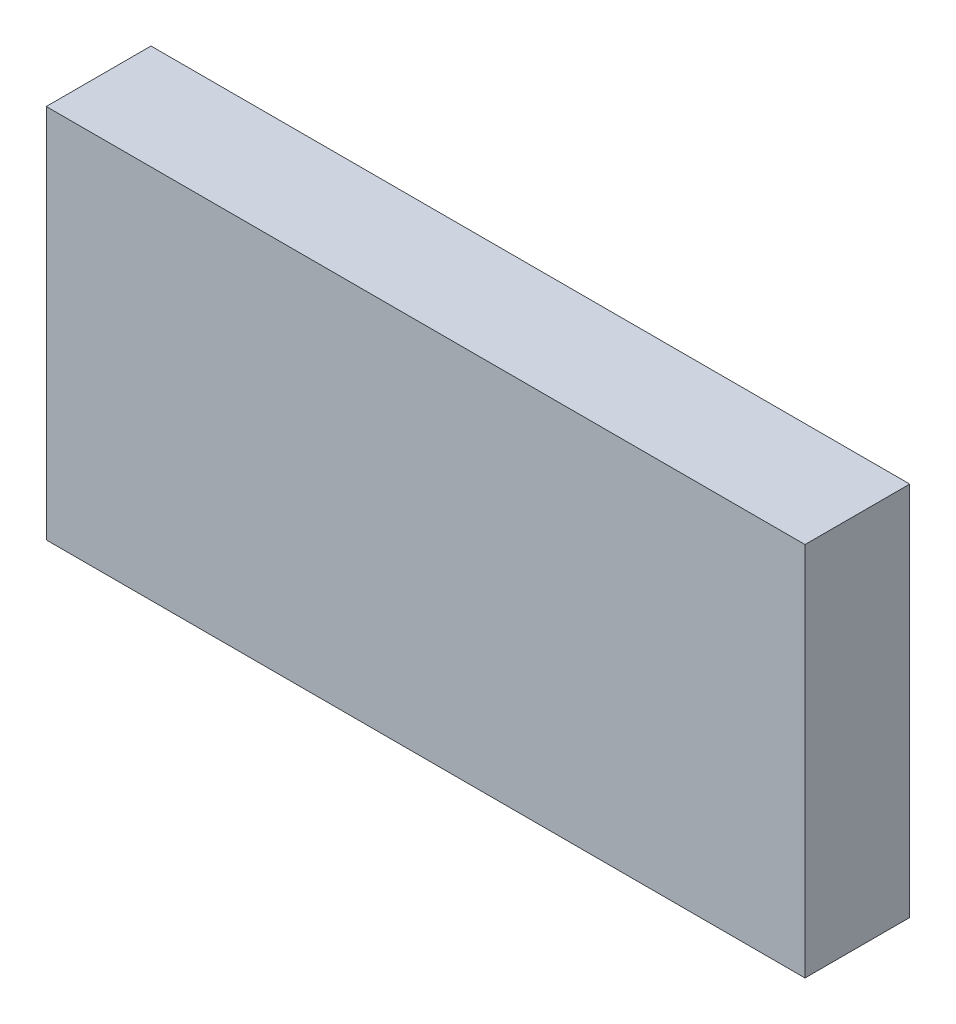
ISO-10303-21;
HEADER;
FILE_DESCRIPTION(('STEP AP214'),'2;1');
FILE_NAME('part.step','',(''),(''),'','','');
FILE_SCHEMA(('AUTOMOTIVE_DESIGN { 1 0 10303 214 1 1 1 1 }'));
ENDSEC;
DATA;
#1=APPLICATION_CONTEXT('core data for automotive mechanical design processes');
#2=APPLICATION_PROTOCOL_DEFINITION('international standard','automotive_design',2000,#1);
#3=PRODUCT_CONTEXT('',#1,'mechanical');
#4=PRODUCT('Part','Part','',(#3));
#5=PRODUCT_RELATED_PRODUCT_CATEGORY('part','',(#4));
#6=PRODUCT_DEFINITION_FORMATION('','',#4);
#7=PRODUCT_DEFINITION_CONTEXT('part definition',#1,'design');
#8=PRODUCT_DEFINITION('design','',#6,#7);
#9=PRODUCT_DEFINITION_SHAPE('','',#8);
#10=(LENGTH_UNIT() NAMED_UNIT(*) SI_UNIT(.MILLI.,.METRE.));
#11=(NAMED_UNIT(*) PLANE_ANGLE_UNIT() SI_UNIT($,.RADIAN.));
#12=(NAMED_UNIT(*) SI_UNIT($,.STERADIAN.) SOLID_ANGLE_UNIT());
#13=UNCERTAINTY_MEASURE_WITH_UNIT(LENGTH_MEASURE(1.E-05),#10,'distance_accuracy_value','');
#14=(GEOMETRIC_REPRESENTATION_CONTEXT(3) GLOBAL_UNCERTAINTY_ASSIGNED_CONTEXT((#13)) GLOBAL_UNIT_ASSIGNED_CONTEXT((#10,
#11,#12)) REPRESENTATION_CONTEXT('',''));
#15=CARTESIAN_POINT('',(0.,0.,0.));
#16=DIRECTION('',(0.,0.,1.));
#17=DIRECTION('',(1.,0.,0.));
#18=AXIS2_PLACEMENT_3D('',#15,#16,#17);
#19=CARTESIAN_POINT('',(-0.0999998000000086,9.0286078,2.54));
#20=DIRECTION('',(1.,0.,0.));
#21=DIRECTION('',(0.,0.,-1.));
#22=AXIS2_PLACEMENT_3D('',#19,#20,#21);
#23=PLANE('',#22);
#24=DIRECTION('',(0.,-1.,0.));
#25=VECTOR('',#24,1.);
#26=CARTESIAN_POINT('',(-0.0999998000000086,9.0286078,0.));
#27=LINE('',#26,#25);
#28=CARTESIAN_POINT('',(-0.0999998000000086,9.0286078,0.));
#29=VERTEX_POINT('',#28);
#30=CARTESIAN_POINT('',(-0.0999998000000086,-0.0745998000000058,0.));
#31=VERTEX_POINT('',#30);
#32=EDGE_CURVE('E95',#29,#31,#27,.T.);
#33=ORIENTED_EDGE('',*,*,#32,.T.);
#34=DIRECTION('',(0.,0.,-1.));
#35=VECTOR('',#34,1.);
#36=CARTESIAN_POINT('',(-0.0999998000000086,-0.0745998000000058,2.54));
#37=LINE('',#36,#35);
#38=CARTESIAN_POINT('',(-0.0999998000000086,-0.0745998000000058,2.54));
#39=VERTEX_POINT('',#38);
#40=EDGE_CURVE('E11',#39,#31,#37,.T.);
#41=ORIENTED_EDGE('',*,*,#40,.F.);
#42=DIRECTION('',(0.,-1.,0.));
#43=VECTOR('',#42,1.);
#44=CARTESIAN_POINT('',(-0.0999998000000086,9.0286078,2.54));
#45=LINE('',#44,#43);
#46=CARTESIAN_POINT('',(-0.0999998000000086,9.0286078,2.54));
#47=VERTEX_POINT('',#46);
#48=EDGE_CURVE('E83',#47,#39,#45,.T.);
#49=ORIENTED_EDGE('',*,*,#48,.F.);
#50=DIRECTION('',(0.,0.,-1.));
#51=VECTOR('',#50,1.);
#52=CARTESIAN_POINT('',(-0.0999998000000086,9.0286078,2.54));
#53=LINE('',#52,#51);
#54=EDGE_CURVE('E91',#47,#29,#53,.T.);
#55=ORIENTED_EDGE('',*,*,#54,.T.);
#56=EDGE_LOOP('',(#33,#41,#49,#55));
#57=FACE_BOUND('',#56,.T.);
#58=ADVANCED_FACE('F32',(#57),#23,.F.);
#59=CARTESIAN_POINT('',(-0.0999998000000086,-0.0745998000000058,2.54));
#60=DIRECTION('',(0.,1.,0.));
#61=DIRECTION('',(0.,0.,1.));
#62=AXIS2_PLACEMENT_3D('',#59,#60,#61);
#63=PLANE('',#62);
#64=DIRECTION('',(1.,0.,0.));
#65=VECTOR('',#64,1.);
#66=CARTESIAN_POINT('',(-0.0999998000000086,-0.0745998000000058,0.));
#67=LINE('',#66,#65);
#68=CARTESIAN_POINT('',(18.2999888,-0.0745998000000058,0.));
#69=VERTEX_POINT('',#68);
#70=EDGE_CURVE('E87',#31,#69,#67,.T.);
#71=ORIENTED_EDGE('',*,*,#70,.T.);
#72=DIRECTION('',(0.,0.,-1.));
#73=VECTOR('',#72,1.);
#74=CARTESIAN_POINT('',(18.2999888,-0.0745998000000058,2.54));
#75=LINE('',#74,#73);
#76=CARTESIAN_POINT('',(18.2999888,-0.0745998000000058,2.54));
#77=VERTEX_POINT('',#76);
#78=EDGE_CURVE('E40',#77,#69,#75,.T.);
#79=ORIENTED_EDGE('',*,*,#78,.F.);
#80=DIRECTION('',(1.,0.,0.));
#81=VECTOR('',#80,1.);
#82=CARTESIAN_POINT('',(-0.0999998000000086,-0.0745998000000058,2.54));
#83=LINE('',#82,#81);
#84=EDGE_CURVE('E78',#39,#77,#83,.T.);
#85=ORIENTED_EDGE('',*,*,#84,.F.);
#86=ORIENTED_EDGE('',*,*,#40,.T.);
#87=EDGE_LOOP('',(#71,#79,#85,#86));
#88=FACE_BOUND('',#87,.T.);
#89=ADVANCED_FACE('F86',(#88),#63,.F.);
#90=CARTESIAN_POINT('',(18.2999888,-0.0745998000000058,2.54));
#91=DIRECTION('',(-1.,0.,0.));
#92=DIRECTION('',(0.,0.,1.));
#93=AXIS2_PLACEMENT_3D('',#90,#91,#92);
#94=PLANE('',#93);
#95=DIRECTION('',(0.,1.,0.));
#96=VECTOR('',#95,1.);
#97=CARTESIAN_POINT('',(18.2999888,-0.0745998000000058,0.));
#98=LINE('',#97,#96);
#99=CARTESIAN_POINT('',(18.2999888,9.0286078,0.));
#100=VERTEX_POINT('',#99);
#101=EDGE_CURVE('E65',#69,#100,#98,.T.);
#102=ORIENTED_EDGE('',*,*,#101,.T.);
#103=DIRECTION('',(0.,0.,-1.));
#104=VECTOR('',#103,1.);
#105=CARTESIAN_POINT('',(18.2999888,9.0286078,2.54));
#106=LINE('',#105,#104);
#107=CARTESIAN_POINT('',(18.2999888,9.0286078,2.54));
#108=VERTEX_POINT('',#107);
#109=EDGE_CURVE('E88',#108,#100,#106,.T.);
#110=ORIENTED_EDGE('',*,*,#109,.F.);
#111=DIRECTION('',(0.,1.,0.));
#112=VECTOR('',#111,1.);
#113=CARTESIAN_POINT('',(18.2999888,-0.0745998000000058,2.54));
#114=LINE('',#113,#112);
#115=EDGE_CURVE('E81',#77,#108,#114,.T.);
#116=ORIENTED_EDGE('',*,*,#115,.F.);
#117=ORIENTED_EDGE('',*,*,#78,.T.);
#118=EDGE_LOOP('',(#102,#110,#116,#117));
#119=FACE_BOUND('',#118,.T.);
#120=ADVANCED_FACE('F89',(#119),#94,.F.);
#121=CARTESIAN_POINT('',(18.2999888,9.0286078,2.54));
#122=DIRECTION('',(0.,-1.,0.));
#123=DIRECTION('',(0.,0.,-1.));
#124=AXIS2_PLACEMENT_3D('',#121,#122,#123);
#125=PLANE('',#124);
#126=DIRECTION('',(-1.,0.,0.));
#127=VECTOR('',#126,1.);
#128=CARTESIAN_POINT('',(18.2999888,9.0286078,0.));
#129=LINE('',#128,#127);
#130=EDGE_CURVE('E71',#100,#29,#129,.T.);
#131=ORIENTED_EDGE('',*,*,#130,.T.);
#132=ORIENTED_EDGE('',*,*,#54,.F.);
#133=DIRECTION('',(-1.,0.,0.));
#134=VECTOR('',#133,1.);
#135=CARTESIAN_POINT('',(18.2999888,9.0286078,2.54));
#136=LINE('',#135,#134);
#137=EDGE_CURVE('E48',#108,#47,#136,.T.);
#138=ORIENTED_EDGE('',*,*,#137,.F.);
#139=ORIENTED_EDGE('',*,*,#109,.T.);
#140=EDGE_LOOP('',(#131,#132,#138,#139));
#141=FACE_BOUND('',#140,.T.);
#142=ADVANCED_FACE('F102',(#141),#125,.F.);
#143=CARTESIAN_POINT('',(0.,0.,2.54));
#144=DIRECTION('',(0.,0.,1.));
#145=DIRECTION('',(1.,0.,0.));
#146=AXIS2_PLACEMENT_3D('',#143,#144,#145);
#147=PLANE('',#146);
#148=ORIENTED_EDGE('',*,*,#48,.T.);
#149=ORIENTED_EDGE('',*,*,#84,.T.);
#150=ORIENTED_EDGE('',*,*,#115,.T.);
#151=ORIENTED_EDGE('',*,*,#137,.T.);
#152=EDGE_LOOP('',(#148,#149,#150,#151));
#153=FACE_BOUND('',#152,.T.);
#154=ADVANCED_FACE('F79',(#153),#147,.T.);
#155=CARTESIAN_POINT('',(0.,0.,0.));
#156=DIRECTION('',(0.,0.,1.));
#157=DIRECTION('',(1.,0.,0.));
#158=AXIS2_PLACEMENT_3D('',#155,#156,#157);
#159=PLANE('',#158);
#160=ORIENTED_EDGE('',*,*,#32,.F.);
#161=ORIENTED_EDGE('',*,*,#130,.F.);
#162=ORIENTED_EDGE('',*,*,#101,.F.);
#163=ORIENTED_EDGE('',*,*,#70,.F.);
#164=EDGE_LOOP('',(#160,#161,#162,#163));
#165=FACE_BOUND('',#164,.T.);
#166=ADVANCED_FACE('F105',(#165),#159,.F.);
#167=CLOSED_SHELL('',(#58,#89,#120,#142,#154,#166));
#168=MANIFOLD_SOLID_BREP('B2',#167);
#169=ADVANCED_BREP_SHAPE_REPRESENTATION('',(#18,#168),#14);
#170=SHAPE_DEFINITION_REPRESENTATION(#9,#169);
ENDSEC;
END-ISO-10303-21;
